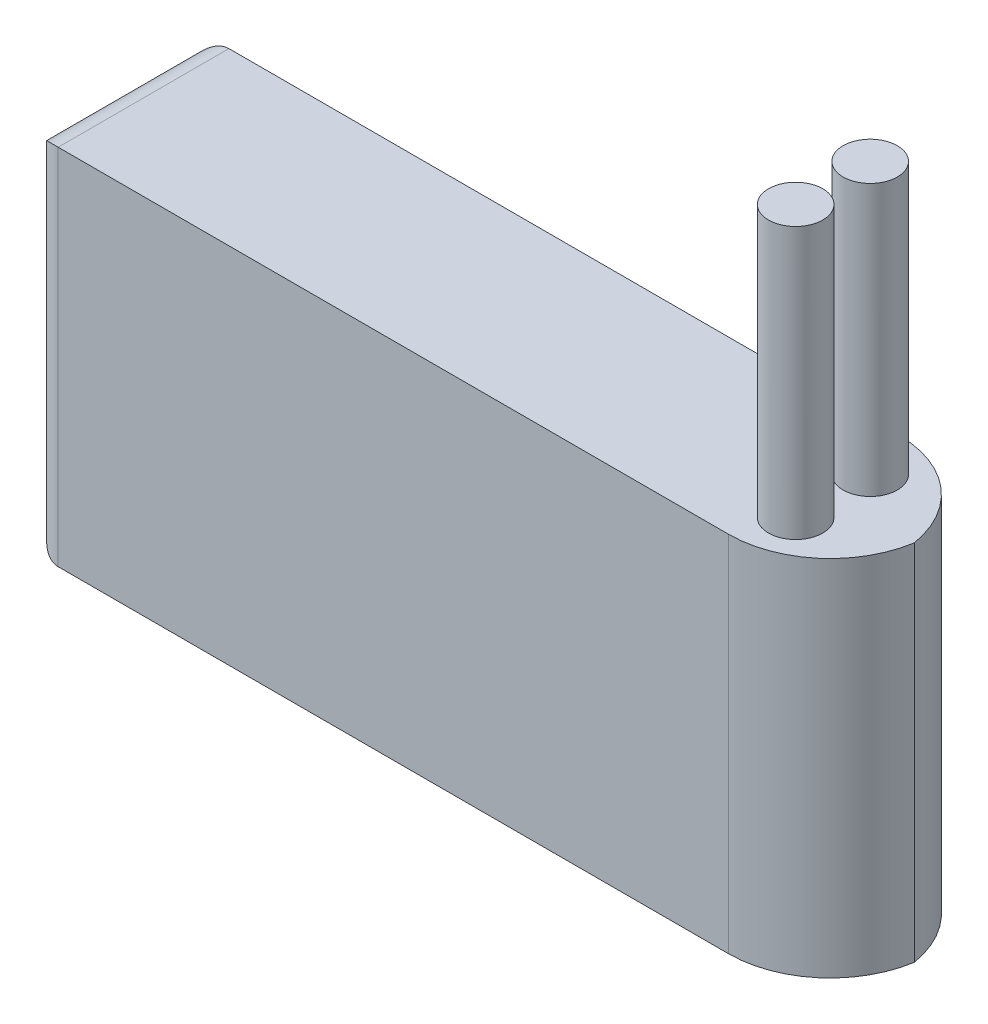
ISO-10303-21;
HEADER;
FILE_DESCRIPTION(('STEP AP214'),'2;1');
FILE_NAME('part.step','',(''),(''),'','','');
FILE_SCHEMA(('AUTOMOTIVE_DESIGN { 1 0 10303 214 1 1 1 1 }'));
ENDSEC;
DATA;
#1=APPLICATION_CONTEXT('core data for automotive mechanical design processes');
#2=APPLICATION_PROTOCOL_DEFINITION('international standard','automotive_design',2000,#1);
#3=PRODUCT_CONTEXT('',#1,'mechanical');
#4=PRODUCT('Part','Part','',(#3));
#5=PRODUCT_RELATED_PRODUCT_CATEGORY('part','',(#4));
#6=PRODUCT_DEFINITION_FORMATION('','',#4);
#7=PRODUCT_DEFINITION_CONTEXT('part definition',#1,'design');
#8=PRODUCT_DEFINITION('design','',#6,#7);
#9=PRODUCT_DEFINITION_SHAPE('','',#8);
#10=(LENGTH_UNIT() NAMED_UNIT(*) SI_UNIT(.MILLI.,.METRE.));
#11=(NAMED_UNIT(*) PLANE_ANGLE_UNIT() SI_UNIT($,.RADIAN.));
#12=(NAMED_UNIT(*) SI_UNIT($,.STERADIAN.) SOLID_ANGLE_UNIT());
#13=UNCERTAINTY_MEASURE_WITH_UNIT(LENGTH_MEASURE(1.E-05),#10,'distance_accuracy_value','');
#14=(GEOMETRIC_REPRESENTATION_CONTEXT(3) GLOBAL_UNCERTAINTY_ASSIGNED_CONTEXT((#13)) GLOBAL_UNIT_ASSIGNED_CONTEXT((#10,
#11,#12)) REPRESENTATION_CONTEXT('',''));
#15=CARTESIAN_POINT('',(0.,0.,0.));
#16=DIRECTION('',(0.,0.,1.));
#17=DIRECTION('',(1.,0.,0.));
#18=AXIS2_PLACEMENT_3D('',#15,#16,#17);
#19=CARTESIAN_POINT('',(0.,0.,16.002));
#20=DIRECTION('',(1.,0.,0.));
#21=DIRECTION('',(0.,0.,-1.));
#22=AXIS2_PLACEMENT_3D('',#19,#20,#21);
#23=PLANE('',#22);
#24=DIRECTION('',(0.,-1.,0.));
#25=VECTOR('',#24,1.);
#26=CARTESIAN_POINT('',(0.,0.,13.3985));
#27=LINE('',#26,#25);
#28=CARTESIAN_POINT('',(0.,2.6035,13.3985));
#29=VERTEX_POINT('',#28);
#30=CARTESIAN_POINT('',(0.,31.4325,13.3985));
#31=VERTEX_POINT('',#30);
#32=EDGE_CURVE('E159',#29,#31,#27,.F.);
#33=ORIENTED_EDGE('',*,*,#32,.T.);
#34=DIRECTION('',(0.,0.,-1.));
#35=VECTOR('',#34,1.);
#36=CARTESIAN_POINT('',(0.,31.4325,16.002));
#37=LINE('',#36,#35);
#38=CARTESIAN_POINT('',(0.,31.4325,2.6035));
#39=VERTEX_POINT('',#38);
#40=EDGE_CURVE('E162',#31,#39,#37,.T.);
#41=ORIENTED_EDGE('',*,*,#40,.T.);
#42=DIRECTION('',(0.,-1.,0.));
#43=VECTOR('',#42,1.);
#44=CARTESIAN_POINT('',(0.,0.,2.6035));
#45=LINE('',#44,#43);
#46=CARTESIAN_POINT('',(0.,2.6035,2.6035));
#47=VERTEX_POINT('',#46);
#48=EDGE_CURVE('E153',#39,#47,#45,.T.);
#49=ORIENTED_EDGE('',*,*,#48,.T.);
#50=DIRECTION('',(0.,0.,-1.));
#51=VECTOR('',#50,1.);
#52=CARTESIAN_POINT('',(0.,2.6035,16.002));
#53=LINE('',#52,#51);
#54=EDGE_CURVE('E156',#47,#29,#53,.F.);
#55=ORIENTED_EDGE('',*,*,#54,.T.);
#56=EDGE_LOOP('',(#33,#41,#49,#55));
#57=FACE_BOUND('',#56,.T.);
#58=ADVANCED_FACE('F41',(#57),#23,.F.);
#59=CARTESIAN_POINT('',(0.,0.,16.002));
#60=DIRECTION('',(0.,1.,0.));
#61=DIRECTION('',(0.,0.,1.));
#62=AXIS2_PLACEMENT_3D('',#59,#60,#61);
#63=PLANE('',#62);
#64=DIRECTION('',(1.,0.,0.));
#65=VECTOR('',#64,1.);
#66=CARTESIAN_POINT('',(0.,0.,16.002));
#67=LINE('',#66,#65);
#68=CARTESIAN_POINT('',(2.6035,0.,16.002));
#69=VERTEX_POINT('',#68);
#70=CARTESIAN_POINT('',(65.405,0.,16.002));
#71=VERTEX_POINT('',#70);
#72=EDGE_CURVE('E100',#69,#71,#67,.T.);
#73=ORIENTED_EDGE('',*,*,#72,.F.);
#74=DIRECTION('',(0.,0.,-1.));
#75=VECTOR('',#74,1.);
#76=CARTESIAN_POINT('',(2.6035,0.,16.002));
#77=LINE('',#76,#75);
#78=CARTESIAN_POINT('',(2.6035,0.,0.));
#79=VERTEX_POINT('',#78);
#80=EDGE_CURVE('E51',#69,#79,#77,.T.);
#81=ORIENTED_EDGE('',*,*,#80,.T.);
#82=DIRECTION('',(1.,0.,0.));
#83=VECTOR('',#82,1.);
#84=CARTESIAN_POINT('',(0.,0.,0.));
#85=LINE('',#84,#83);
#86=CARTESIAN_POINT('',(65.405,0.,0.));
#87=VERTEX_POINT('',#86);
#88=EDGE_CURVE('E144',#79,#87,#85,.T.);
#89=ORIENTED_EDGE('',*,*,#88,.T.);
#90=CARTESIAN_POINT('',(65.405,0.,9.525));
#91=DIRECTION('',(0.,1.,0.));
#92=DIRECTION('',(0.,0.,1.));
#93=AXIS2_PLACEMENT_3D('',#90,#91,#92);
#94=CIRCLE('',#93,9.525);
#95=CARTESIAN_POINT('',(74.8072895615908,0.,8.001));
#96=VERTEX_POINT('',#95);
#97=EDGE_CURVE('E114',#87,#96,#94,.F.);
#98=ORIENTED_EDGE('',*,*,#97,.T.);
#99=CARTESIAN_POINT('',(65.405,0.,6.477));
#100=DIRECTION('',(0.,1.,0.));
#101=DIRECTION('',(0.,0.,1.));
#102=AXIS2_PLACEMENT_3D('',#99,#100,#101);
#103=CIRCLE('',#102,9.525);
#104=EDGE_CURVE('E111',#96,#71,#103,.F.);
#105=ORIENTED_EDGE('',*,*,#104,.T.);
#106=EDGE_LOOP('',(#73,#81,#89,#98,#105));
#107=FACE_BOUND('',#106,.T.);
#108=ADVANCED_FACE('F112',(#107),#63,.F.);
#109=CARTESIAN_POINT('',(0.,34.036,16.002));
#110=DIRECTION('',(0.,-1.,0.));
#111=DIRECTION('',(0.,0.,-1.));
#112=AXIS2_PLACEMENT_3D('',#109,#110,#111);
#113=PLANE('',#112);
#114=CARTESIAN_POINT('',(67.1872895615908,34.036,11.4935));
#115=DIRECTION('',(0.,-1.,0.));
#116=DIRECTION('',(0.,0.,-1.));
#117=AXIS2_PLACEMENT_3D('',#114,#115,#116);
#118=CIRCLE('',#117,2.54);
#119=CARTESIAN_POINT('',(67.1872895615908,34.036,8.95350000000001));
#120=VERTEX_POINT('',#119);
#121=EDGE_CURVE('E149',#120,#120,#118,.F.);
#122=ORIENTED_EDGE('',*,*,#121,.F.);
#123=EDGE_LOOP('',(#122));
#124=FACE_BOUND('',#123,.T.);
#125=CARTESIAN_POINT('',(67.1872895615908,34.036,4.5085));
#126=DIRECTION('',(0.,-1.,0.));
#127=DIRECTION('',(0.,0.,-1.));
#128=AXIS2_PLACEMENT_3D('',#125,#126,#127);
#129=CIRCLE('',#128,2.54);
#130=CARTESIAN_POINT('',(67.1872895615908,34.036,1.9685));
#131=VERTEX_POINT('',#130);
#132=EDGE_CURVE('E140',#131,#131,#129,.F.);
#133=ORIENTED_EDGE('',*,*,#132,.F.);
#134=EDGE_LOOP('',(#133));
#135=FACE_BOUND('',#134,.T.);
#136=DIRECTION('',(-1.,0.,0.));
#137=VECTOR('',#136,1.);
#138=CARTESIAN_POINT('',(0.,34.036,0.));
#139=LINE('',#138,#137);
#140=CARTESIAN_POINT('',(65.405,34.036,0.));
#141=VERTEX_POINT('',#140);
#142=CARTESIAN_POINT('',(2.6035,34.036,0.));
#143=VERTEX_POINT('',#142);
#144=EDGE_CURVE('E108',#141,#143,#139,.T.);
#145=ORIENTED_EDGE('',*,*,#144,.T.);
#146=DIRECTION('',(0.,0.,-1.));
#147=VECTOR('',#146,1.);
#148=CARTESIAN_POINT('',(2.6035,34.036,16.002));
#149=LINE('',#148,#147);
#150=CARTESIAN_POINT('',(2.6035,34.036,16.002));
#151=VERTEX_POINT('',#150);
#152=EDGE_CURVE('E166',#143,#151,#149,.F.);
#153=ORIENTED_EDGE('',*,*,#152,.T.);
#154=DIRECTION('',(-1.,0.,0.));
#155=VECTOR('',#154,1.);
#156=CARTESIAN_POINT('',(0.,34.036,16.002));
#157=LINE('',#156,#155);
#158=CARTESIAN_POINT('',(65.405,34.036,16.002));
#159=VERTEX_POINT('',#158);
#160=EDGE_CURVE('E107',#159,#151,#157,.T.);
#161=ORIENTED_EDGE('',*,*,#160,.F.);
#162=CARTESIAN_POINT('',(65.405,34.036,6.477));
#163=DIRECTION('',(0.,-1.,0.));
#164=DIRECTION('',(0.,0.,-1.));
#165=AXIS2_PLACEMENT_3D('',#162,#163,#164);
#166=CIRCLE('',#165,9.525);
#167=CARTESIAN_POINT('',(74.8072895615908,34.036,8.001));
#168=VERTEX_POINT('',#167);
#169=EDGE_CURVE('E122',#159,#168,#166,.F.);
#170=ORIENTED_EDGE('',*,*,#169,.T.);
#171=CARTESIAN_POINT('',(65.405,34.036,9.525));
#172=DIRECTION('',(0.,-1.,0.));
#173=DIRECTION('',(0.,0.,-1.));
#174=AXIS2_PLACEMENT_3D('',#171,#172,#173);
#175=CIRCLE('',#174,9.525);
#176=EDGE_CURVE('E124',#168,#141,#175,.F.);
#177=ORIENTED_EDGE('',*,*,#176,.T.);
#178=EDGE_LOOP('',(#145,#153,#161,#170,#177));
#179=FACE_BOUND('',#178,.T.);
#180=ADVANCED_FACE('F206',(#124,#135,#179),#113,.F.);
#181=CARTESIAN_POINT('',(0.,0.,16.002));
#182=DIRECTION('',(0.,0.,-1.));
#183=DIRECTION('',(-1.,0.,0.));
#184=AXIS2_PLACEMENT_3D('',#181,#182,#183);
#185=PLANE('',#184);
#186=ORIENTED_EDGE('',*,*,#160,.T.);
#187=DIRECTION('',(0.,-1.,0.));
#188=VECTOR('',#187,1.);
#189=CARTESIAN_POINT('',(2.6035,0.,16.002));
#190=LINE('',#189,#188);
#191=EDGE_CURVE('E66',#151,#69,#190,.T.);
#192=ORIENTED_EDGE('',*,*,#191,.T.);
#193=ORIENTED_EDGE('',*,*,#72,.T.);
#194=DIRECTION('',(0.,1.,0.));
#195=VECTOR('',#194,1.);
#196=CARTESIAN_POINT('',(65.405,0.,16.002));
#197=LINE('',#196,#195);
#198=EDGE_CURVE('E104',#71,#159,#197,.T.);
#199=ORIENTED_EDGE('',*,*,#198,.T.);
#200=EDGE_LOOP('',(#186,#192,#193,#199));
#201=FACE_BOUND('',#200,.T.);
#202=ADVANCED_FACE('F102',(#201),#185,.F.);
#203=CARTESIAN_POINT('',(0.,0.,0.));
#204=DIRECTION('',(0.,0.,-1.));
#205=DIRECTION('',(-1.,0.,0.));
#206=AXIS2_PLACEMENT_3D('',#203,#204,#205);
#207=PLANE('',#206);
#208=ORIENTED_EDGE('',*,*,#88,.F.);
#209=DIRECTION('',(0.,-1.,0.));
#210=VECTOR('',#209,1.);
#211=CARTESIAN_POINT('',(2.6035,34.036,0.));
#212=LINE('',#211,#210);
#213=EDGE_CURVE('E11',#79,#143,#212,.F.);
#214=ORIENTED_EDGE('',*,*,#213,.T.);
#215=ORIENTED_EDGE('',*,*,#144,.F.);
#216=DIRECTION('',(0.,1.,0.));
#217=VECTOR('',#216,1.);
#218=CARTESIAN_POINT('',(65.405,0.,0.));
#219=LINE('',#218,#217);
#220=EDGE_CURVE('E119',#141,#87,#219,.F.);
#221=ORIENTED_EDGE('',*,*,#220,.T.);
#222=EDGE_LOOP('',(#208,#214,#215,#221));
#223=FACE_BOUND('',#222,.T.);
#224=ADVANCED_FACE('F241',(#223),#207,.T.);
#225=CARTESIAN_POINT('',(65.405,0.,9.525));
#226=DIRECTION('',(0.,-1.,0.));
#227=DIRECTION('',(0.,0.,-1.));
#228=AXIS2_PLACEMENT_3D('',#225,#226,#227);
#229=CYLINDRICAL_SURFACE('',#228,9.525);
#230=DIRECTION('',(0.,-1.,0.));
#231=VECTOR('',#230,1.);
#232=CARTESIAN_POINT('',(74.8072895615908,17.018,8.001));
#233=LINE('',#232,#231);
#234=EDGE_CURVE('E141',#96,#168,#233,.F.);
#235=ORIENTED_EDGE('',*,*,#234,.F.);
#236=ORIENTED_EDGE('',*,*,#97,.F.);
#237=ORIENTED_EDGE('',*,*,#220,.F.);
#238=ORIENTED_EDGE('',*,*,#176,.F.);
#239=EDGE_LOOP('',(#235,#236,#237,#238));
#240=FACE_BOUND('',#239,.T.);
#241=ADVANCED_FACE('F238',(#240),#229,.T.);
#242=CARTESIAN_POINT('',(65.405,0.,6.477));
#243=DIRECTION('',(0.,1.,0.));
#244=DIRECTION('',(0.,0.,1.));
#245=AXIS2_PLACEMENT_3D('',#242,#243,#244);
#246=CYLINDRICAL_SURFACE('',#245,9.525);
#247=ORIENTED_EDGE('',*,*,#104,.F.);
#248=ORIENTED_EDGE('',*,*,#234,.T.);
#249=ORIENTED_EDGE('',*,*,#169,.F.);
#250=ORIENTED_EDGE('',*,*,#198,.F.);
#251=EDGE_LOOP('',(#247,#248,#249,#250));
#252=FACE_BOUND('',#251,.T.);
#253=ADVANCED_FACE('F121',(#252),#246,.T.);
#254=CARTESIAN_POINT('',(67.1872895615908,59.436,4.5085));
#255=DIRECTION('',(0.,-1.,0.));
#256=DIRECTION('',(0.,0.,-1.));
#257=AXIS2_PLACEMENT_3D('',#254,#255,#256);
#258=CYLINDRICAL_SURFACE('',#257,2.54);
#259=CARTESIAN_POINT('',(67.1872895615908,59.436,4.5085));
#260=DIRECTION('',(0.,1.,0.));
#261=DIRECTION('',(0.,0.,1.));
#262=AXIS2_PLACEMENT_3D('',#259,#260,#261);
#263=CIRCLE('',#262,2.54);
#264=CARTESIAN_POINT('',(67.1872895615908,59.436,7.04849999999999));
#265=VERTEX_POINT('',#264);
#266=EDGE_CURVE('E145',#265,#265,#263,.T.);
#267=ORIENTED_EDGE('',*,*,#266,.F.);
#268=EDGE_LOOP('',(#267));
#269=FACE_BOUND('',#268,.T.);
#270=ORIENTED_EDGE('',*,*,#132,.T.);
#271=EDGE_LOOP('',(#270));
#272=FACE_BOUND('',#271,.T.);
#273=ADVANCED_FACE('F237',(#269,#272),#258,.T.);
#274=CARTESIAN_POINT('',(67.1872895615908,59.436,4.5085));
#275=DIRECTION('',(0.,1.,0.));
#276=DIRECTION('',(0.,0.,1.));
#277=AXIS2_PLACEMENT_3D('',#274,#275,#276);
#278=PLANE('',#277);
#279=ORIENTED_EDGE('',*,*,#266,.T.);
#280=EDGE_LOOP('',(#279));
#281=FACE_BOUND('',#280,.T.);
#282=ADVANCED_FACE('F314',(#281),#278,.T.);
#283=CARTESIAN_POINT('',(67.1872895615908,59.436,11.4935));
#284=DIRECTION('',(0.,-1.,0.));
#285=DIRECTION('',(0.,0.,-1.));
#286=AXIS2_PLACEMENT_3D('',#283,#284,#285);
#287=CYLINDRICAL_SURFACE('',#286,2.54);
#288=CARTESIAN_POINT('',(67.1872895615908,59.436,11.4935));
#289=DIRECTION('',(0.,1.,0.));
#290=DIRECTION('',(0.,0.,1.));
#291=AXIS2_PLACEMENT_3D('',#288,#289,#290);
#292=CIRCLE('',#291,2.54);
#293=CARTESIAN_POINT('',(67.1872895615908,59.436,14.0335));
#294=VERTEX_POINT('',#293);
#295=EDGE_CURVE('E188',#294,#294,#292,.T.);
#296=ORIENTED_EDGE('',*,*,#295,.F.);
#297=EDGE_LOOP('',(#296));
#298=FACE_BOUND('',#297,.T.);
#299=ORIENTED_EDGE('',*,*,#121,.T.);
#300=EDGE_LOOP('',(#299));
#301=FACE_BOUND('',#300,.T.);
#302=ADVANCED_FACE('F304',(#298,#301),#287,.T.);
#303=CARTESIAN_POINT('',(67.1872895615908,59.436,11.4935));
#304=DIRECTION('',(0.,1.,0.));
#305=DIRECTION('',(0.,0.,1.));
#306=AXIS2_PLACEMENT_3D('',#303,#304,#305);
#307=PLANE('',#306);
#308=ORIENTED_EDGE('',*,*,#295,.T.);
#309=EDGE_LOOP('',(#308));
#310=FACE_BOUND('',#309,.T.);
#311=ADVANCED_FACE('F225',(#310),#307,.T.);
#312=CARTESIAN_POINT('',(2.6035,2.6035,16.002));
#313=DIRECTION('',(0.,0.,-1.));
#314=DIRECTION('',(-1.,0.,0.));
#315=AXIS2_PLACEMENT_3D('',#312,#313,#314);
#316=CYLINDRICAL_SURFACE('',#315,2.6035);
#317=CARTESIAN_POINT('',(2.6035,2.6035,2.6035));
#318=DIRECTION('',(0.,0.707106781186547,-0.707106781186547));
#319=DIRECTION('',(0.,0.707106781186547,0.707106781186547));
#320=AXIS2_PLACEMENT_3D('',#317,#318,#319);
#321=ELLIPSE('',#320,3.68190500963835,2.6035);
#322=EDGE_CURVE('E179',#79,#47,#321,.T.);
#323=ORIENTED_EDGE('',*,*,#322,.F.);
#324=ORIENTED_EDGE('',*,*,#80,.F.);
#325=CARTESIAN_POINT('',(2.6035,2.6035,13.3985));
#326=DIRECTION('',(0.,-0.707106781186547,-0.707106781186547));
#327=DIRECTION('',(0.,0.707106781186547,-0.707106781186547));
#328=AXIS2_PLACEMENT_3D('',#325,#326,#327);
#329=ELLIPSE('',#328,3.68190500963835,2.6035);
#330=EDGE_CURVE('E45',#29,#69,#329,.F.);
#331=ORIENTED_EDGE('',*,*,#330,.F.);
#332=ORIENTED_EDGE('',*,*,#54,.F.);
#333=EDGE_LOOP('',(#323,#324,#331,#332));
#334=FACE_BOUND('',#333,.T.);
#335=ADVANCED_FACE('F43',(#334),#316,.T.);
#336=CARTESIAN_POINT('',(2.6035,0.,13.3985));
#337=DIRECTION('',(0.,-1.,0.));
#338=DIRECTION('',(0.,0.,-1.));
#339=AXIS2_PLACEMENT_3D('',#336,#337,#338);
#340=CYLINDRICAL_SURFACE('',#339,2.6035);
#341=ORIENTED_EDGE('',*,*,#330,.T.);
#342=ORIENTED_EDGE('',*,*,#191,.F.);
#343=CARTESIAN_POINT('',(2.6035,31.4325,13.3985));
#344=DIRECTION('',(0.,-0.707106781186547,0.707106781186547));
#345=DIRECTION('',(0.,-0.707106781186547,-0.707106781186547));
#346=AXIS2_PLACEMENT_3D('',#343,#344,#345);
#347=ELLIPSE('',#346,3.68190500963835,2.6035);
#348=EDGE_CURVE('E177',#31,#151,#347,.F.);
#349=ORIENTED_EDGE('',*,*,#348,.F.);
#350=ORIENTED_EDGE('',*,*,#32,.F.);
#351=EDGE_LOOP('',(#341,#342,#349,#350));
#352=FACE_BOUND('',#351,.T.);
#353=ADVANCED_FACE('F218',(#352),#340,.T.);
#354=CARTESIAN_POINT('',(2.6035,0.,2.6035));
#355=DIRECTION('',(0.,1.,0.));
#356=DIRECTION('',(0.,0.,1.));
#357=AXIS2_PLACEMENT_3D('',#354,#355,#356);
#358=CYLINDRICAL_SURFACE('',#357,2.6035);
#359=ORIENTED_EDGE('',*,*,#322,.T.);
#360=ORIENTED_EDGE('',*,*,#48,.F.);
#361=CARTESIAN_POINT('',(2.6035,31.4325,2.6035));
#362=DIRECTION('',(0.,0.707106781186547,0.707106781186547));
#363=DIRECTION('',(0.,0.707106781186547,-0.707106781186547));
#364=AXIS2_PLACEMENT_3D('',#361,#362,#363);
#365=ELLIPSE('',#364,3.68190500963835,2.6035);
#366=EDGE_CURVE('E174',#143,#39,#365,.T.);
#367=ORIENTED_EDGE('',*,*,#366,.F.);
#368=ORIENTED_EDGE('',*,*,#213,.F.);
#369=EDGE_LOOP('',(#359,#360,#367,#368));
#370=FACE_BOUND('',#369,.T.);
#371=ADVANCED_FACE('F215',(#370),#358,.T.);
#372=CARTESIAN_POINT('',(2.6035,31.4325,16.002));
#373=DIRECTION('',(0.,0.,-1.));
#374=DIRECTION('',(-1.,0.,0.));
#375=AXIS2_PLACEMENT_3D('',#372,#373,#374);
#376=CYLINDRICAL_SURFACE('',#375,2.6035);
#377=ORIENTED_EDGE('',*,*,#348,.T.);
#378=ORIENTED_EDGE('',*,*,#152,.F.);
#379=ORIENTED_EDGE('',*,*,#366,.T.);
#380=ORIENTED_EDGE('',*,*,#40,.F.);
#381=EDGE_LOOP('',(#377,#378,#379,#380));
#382=FACE_BOUND('',#381,.T.);
#383=ADVANCED_FACE('F212',(#382),#376,.T.);
#384=CLOSED_SHELL('',(#58,#108,#180,#202,#224,#241,#253,#273,#282,#302,#311,#335,#353,#371,#383));
#385=MANIFOLD_SOLID_BREP('B2',#384);
#386=ADVANCED_BREP_SHAPE_REPRESENTATION('',(#18,#385),#14);
#387=SHAPE_DEFINITION_REPRESENTATION(#9,#386);
ENDSEC;
END-ISO-10303-21;
